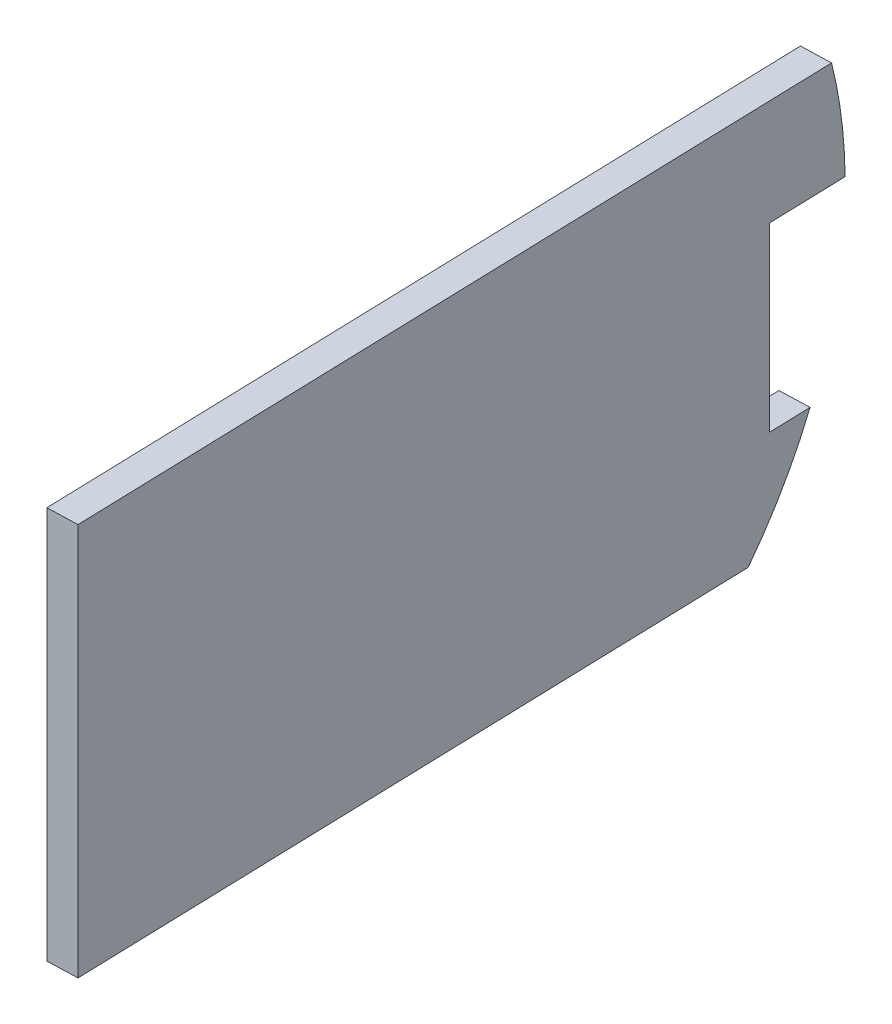
ISO-10303-21;
HEADER;
FILE_DESCRIPTION(('STEP AP214'),'2;1');
FILE_NAME('part.step','',(''),(''),'','','');
FILE_SCHEMA(('AUTOMOTIVE_DESIGN { 1 0 10303 214 1 1 1 1 }'));
ENDSEC;
DATA;
#1=APPLICATION_CONTEXT('core data for automotive mechanical design processes');
#2=APPLICATION_PROTOCOL_DEFINITION('international standard','automotive_design',2000,#1);
#3=PRODUCT_CONTEXT('',#1,'mechanical');
#4=PRODUCT('Part','Part','',(#3));
#5=PRODUCT_RELATED_PRODUCT_CATEGORY('part','',(#4));
#6=PRODUCT_DEFINITION_FORMATION('','',#4);
#7=PRODUCT_DEFINITION_CONTEXT('part definition',#1,'design');
#8=PRODUCT_DEFINITION('design','',#6,#7);
#9=PRODUCT_DEFINITION_SHAPE('','',#8);
#10=(LENGTH_UNIT() NAMED_UNIT(*) SI_UNIT(.MILLI.,.METRE.));
#11=(NAMED_UNIT(*) PLANE_ANGLE_UNIT() SI_UNIT($,.RADIAN.));
#12=(NAMED_UNIT(*) SI_UNIT($,.STERADIAN.) SOLID_ANGLE_UNIT());
#13=UNCERTAINTY_MEASURE_WITH_UNIT(LENGTH_MEASURE(1.E-05),#10,'distance_accuracy_value','');
#14=(GEOMETRIC_REPRESENTATION_CONTEXT(3) GLOBAL_UNCERTAINTY_ASSIGNED_CONTEXT((#13)) GLOBAL_UNIT_ASSIGNED_CONTEXT((#10,
#11,#12)) REPRESENTATION_CONTEXT('',''));
#15=CARTESIAN_POINT('',(0.,0.,0.));
#16=DIRECTION('',(0.,0.,1.));
#17=DIRECTION('',(1.,0.,0.));
#18=AXIS2_PLACEMENT_3D('',#15,#16,#17);
#19=CARTESIAN_POINT('',(-4.18759539835807,34.9489254476313,-56.5128425564197));
#20=DIRECTION('',(0.999559528399924,0.,-0.0296774187712064));
#21=DIRECTION('',(-0.0296774187712064,0.,-0.999559528399924));
#22=AXIS2_PLACEMENT_3D('',#19,#20,#21);
#23=CYLINDRICAL_SURFACE('',#22,74.0000000000029);
#24=CARTESIAN_POINT('',(-4.18759539835807,34.9489254476313,-56.5128425564197));
#25=DIRECTION('',(0.999559528399924,0.,-0.0296774187712064));
#26=DIRECTION('',(0.0296774187712064,0.,0.999559528399924));
#27=AXIS2_PLACEMENT_3D('',#24,#25,#26);
#28=CIRCLE('',#27,74.0000000000029);
#29=CARTESIAN_POINT('',(-5.8924764687525,-11.696898822567,-113.934619424521));
#30=VERTEX_POINT('',#29);
#31=CARTESIAN_POINT('',(-6.2062099073756,5.80310117743449,-124.501416030756));
#32=VERTEX_POINT('',#31);
#33=EDGE_CURVE('E158',#30,#32,#28,.T.);
#34=ORIENTED_EDGE('',*,*,#33,.T.);
#35=DIRECTION('',(0.999559528399924,0.,-0.0296774187712064));
#36=VECTOR('',#35,1.);
#37=CARTESIAN_POINT('',(-6.2062099073756,5.80310117743449,-124.501416030756));
#38=LINE('',#37,#36);
#39=CARTESIAN_POINT('',(-1.20841226537599,5.8031011774345,-124.649803124612));
#40=VERTEX_POINT('',#39);
#41=EDGE_CURVE('E164',#32,#40,#38,.T.);
#42=ORIENTED_EDGE('',*,*,#41,.T.);
#43=CARTESIAN_POINT('',(0.810202243641547,34.9489254476313,-56.6612296502757));
#44=DIRECTION('',(0.999559528399924,0.,-0.0296774187712064));
#45=DIRECTION('',(0.0296774187712064,0.,0.999559528399924));
#46=AXIS2_PLACEMENT_3D('',#43,#44,#45);
#47=CIRCLE('',#46,74.0000000000029);
#48=CARTESIAN_POINT('',(-0.894678826752876,-11.696898822567,-114.083006518377));
#49=VERTEX_POINT('',#48);
#50=EDGE_CURVE('E128',#49,#40,#47,.T.);
#51=ORIENTED_EDGE('',*,*,#50,.F.);
#52=DIRECTION('',(0.999559528399924,0.,-0.0296774187712064));
#53=VECTOR('',#52,1.);
#54=CARTESIAN_POINT('',(-5.8924764687525,-11.696898822567,-113.934619424521));
#55=LINE('',#54,#53);
#56=EDGE_CURVE('E145',#30,#49,#55,.T.);
#57=ORIENTED_EDGE('',*,*,#56,.F.);
#58=EDGE_LOOP('',(#34,#42,#51,#57));
#59=FACE_BOUND('',#58,.T.);
#60=ADVANCED_FACE('F33',(#59),#23,.T.);
#61=CARTESIAN_POINT('',(-4.18759539835807,34.9489254476313,-56.5128425564197));
#62=DIRECTION('',(-0.999559528399924,0.,0.0296774187712064));
#63=DIRECTION('',(0.0296774187712064,0.,0.999559528399924));
#64=AXIS2_PLACEMENT_3D('',#61,#62,#63);
#65=PLANE('',#64);
#66=DIRECTION('',(0.,1.,0.));
#67=VECTOR('',#66,1.);
#68=CARTESIAN_POINT('',(-6.00012013096211,34.9489254476313,-117.560145251513));
#69=LINE('',#68,#67);
#70=CARTESIAN_POINT('',(-6.00012013096211,5.80310117743449,-117.560145251513));
#71=VERTEX_POINT('',#70);
#72=CARTESIAN_POINT('',(-6.00012013096211,35.8031011774345,-117.560145251513));
#73=VERTEX_POINT('',#72);
#74=EDGE_CURVE('E166',#71,#73,#69,.T.);
#75=ORIENTED_EDGE('',*,*,#74,.F.);
#76=DIRECTION('',(-0.0296774187712064,0.,-0.999559528399924));
#77=VECTOR('',#76,1.);
#78=CARTESIAN_POINT('',(-4.18759539835807,5.80310117743447,-56.5128425564197));
#79=LINE('',#78,#77);
#80=EDGE_CURVE('E112',#71,#32,#79,.T.);
#81=ORIENTED_EDGE('',*,*,#80,.T.);
#82=ORIENTED_EDGE('',*,*,#33,.F.);
#83=DIRECTION('',(-0.0296774187712064,0.,-0.999559528399924));
#84=VECTOR('',#83,1.);
#85=CARTESIAN_POINT('',(-2.4977976419995,-11.6968988225669,0.400916064521021));
#86=LINE('',#85,#84);
#87=CARTESIAN_POINT('',(-2.4977976419995,-11.6968988225669,0.400916064521021));
#88=VERTEX_POINT('',#87);
#89=EDGE_CURVE('E170',#88,#30,#86,.T.);
#90=ORIENTED_EDGE('',*,*,#89,.F.);
#91=DIRECTION('',(0.,-1.,0.));
#92=VECTOR('',#91,1.);
#93=CARTESIAN_POINT('',(-2.49779764199951,53.3031011774333,0.400916064521021));
#94=LINE('',#93,#92);
#95=CARTESIAN_POINT('',(-2.49779764199951,53.3031011774333,0.400916064521021));
#96=VERTEX_POINT('',#95);
#97=EDGE_CURVE('E136',#96,#88,#94,.T.);
#98=ORIENTED_EDGE('',*,*,#97,.F.);
#99=DIRECTION('',(0.0296774187712064,0.,0.999559528399924));
#100=VECTOR('',#99,1.);
#101=CARTESIAN_POINT('',(-5.97636299558322,53.3031011774348,-116.759985668278));
#102=LINE('',#101,#100);
#103=CARTESIAN_POINT('',(-6.31510085773342,53.3031011774348,-128.168951533954));
#104=VERTEX_POINT('',#103);
#105=EDGE_CURVE('E57',#104,#96,#102,.T.);
#106=ORIENTED_EDGE('',*,*,#105,.F.);
#107=CARTESIAN_POINT('',(-6.38357807765617,35.8031011774345,-130.475319826284));
#108=VERTEX_POINT('',#107);
#109=EDGE_CURVE('E151',#108,#104,#28,.T.);
#110=ORIENTED_EDGE('',*,*,#109,.F.);
#111=DIRECTION('',(-0.0296774187712064,0.,-0.999559528399924));
#112=VECTOR('',#111,1.);
#113=CARTESIAN_POINT('',(-4.18759539835807,35.8031011774345,-56.5128425564197));
#114=LINE('',#113,#112);
#115=EDGE_CURVE('E115',#73,#108,#114,.T.);
#116=ORIENTED_EDGE('',*,*,#115,.F.);
#117=EDGE_LOOP('',(#75,#81,#82,#90,#98,#106,#110,#116));
#118=FACE_BOUND('',#117,.T.);
#119=ADVANCED_FACE('F155',(#118),#65,.T.);
#120=CARTESIAN_POINT('',(0.810202243641547,34.9489254476313,-56.6612296502757));
#121=DIRECTION('',(-0.999559528399924,0.,0.0296774187712064));
#122=DIRECTION('',(0.0296774187712064,0.,0.999559528399924));
#123=AXIS2_PLACEMENT_3D('',#120,#121,#122);
#124=PLANE('',#123);
#125=DIRECTION('',(-0.0296774187712064,0.,-0.999559528399924));
#126=VECTOR('',#125,1.);
#127=CARTESIAN_POINT('',(0.81020224364155,5.80310117743447,-56.6612296502757));
#128=LINE('',#127,#126);
#129=CARTESIAN_POINT('',(-1.00232248896249,5.80310117743449,-117.708532345369));
#130=VERTEX_POINT('',#129);
#131=EDGE_CURVE('E11',#130,#40,#128,.T.);
#132=ORIENTED_EDGE('',*,*,#131,.F.);
#133=DIRECTION('',(0.,-1.,0.));
#134=VECTOR('',#133,1.);
#135=CARTESIAN_POINT('',(-1.0023224889625,35.8031011774345,-117.708532345369));
#136=LINE('',#135,#134);
#137=CARTESIAN_POINT('',(-1.0023224889625,35.8031011774345,-117.708532345369));
#138=VERTEX_POINT('',#137);
#139=EDGE_CURVE('E119',#138,#130,#136,.T.);
#140=ORIENTED_EDGE('',*,*,#139,.F.);
#141=DIRECTION('',(-0.0296774187712064,0.,-0.999559528399924));
#142=VECTOR('',#141,1.);
#143=CARTESIAN_POINT('',(0.810202243641547,35.8031011774345,-56.6612296502757));
#144=LINE('',#143,#142);
#145=CARTESIAN_POINT('',(-1.38578043565655,35.8031011774345,-130.623706920141));
#146=VERTEX_POINT('',#145);
#147=EDGE_CURVE('E41',#138,#146,#144,.T.);
#148=ORIENTED_EDGE('',*,*,#147,.T.);
#149=CARTESIAN_POINT('',(-1.3173032157338,53.3031011774348,-128.31733862781));
#150=VERTEX_POINT('',#149);
#151=EDGE_CURVE('E133',#146,#150,#47,.T.);
#152=ORIENTED_EDGE('',*,*,#151,.T.);
#153=DIRECTION('',(0.0296774187712064,0.,0.999559528399924));
#154=VECTOR('',#153,1.);
#155=CARTESIAN_POINT('',(2.50000000000011,53.3031011774333,0.252528970664989));
#156=LINE('',#155,#154);
#157=CARTESIAN_POINT('',(2.50000000000011,53.3031011774333,0.252528970664989));
#158=VERTEX_POINT('',#157);
#159=EDGE_CURVE('E132',#150,#158,#156,.T.);
#160=ORIENTED_EDGE('',*,*,#159,.T.);
#161=DIRECTION('',(0.,-1.,0.));
#162=VECTOR('',#161,1.);
#163=CARTESIAN_POINT('',(2.50000000000011,53.3031011774333,0.252528970664989));
#164=LINE('',#163,#162);
#165=CARTESIAN_POINT('',(2.50000000000012,-11.6968988225669,0.252528970664989));
#166=VERTEX_POINT('',#165);
#167=EDGE_CURVE('E163',#158,#166,#164,.T.);
#168=ORIENTED_EDGE('',*,*,#167,.T.);
#169=DIRECTION('',(-0.0296774187712064,0.,-0.999559528399924));
#170=VECTOR('',#169,1.);
#171=CARTESIAN_POINT('',(2.50000000000012,-11.6968988225669,0.252528970664989));
#172=LINE('',#171,#170);
#173=EDGE_CURVE('E130',#166,#49,#172,.T.);
#174=ORIENTED_EDGE('',*,*,#173,.T.);
#175=ORIENTED_EDGE('',*,*,#50,.T.);
#176=EDGE_LOOP('',(#132,#140,#148,#152,#160,#168,#174,#175));
#177=FACE_BOUND('',#176,.T.);
#178=ADVANCED_FACE('F125',(#177),#124,.F.);
#179=CARTESIAN_POINT('',(-2.49779764199951,53.3031011774333,0.400916064521021));
#180=DIRECTION('',(0.0296774187712064,0.,0.999559528399924));
#181=DIRECTION('',(0.999559528399924,0.,-0.0296774187712064));
#182=AXIS2_PLACEMENT_3D('',#179,#180,#181);
#183=PLANE('',#182);
#184=ORIENTED_EDGE('',*,*,#167,.F.);
#185=DIRECTION('',(0.999559528399924,0.,-0.0296774187712064));
#186=VECTOR('',#185,1.);
#187=CARTESIAN_POINT('',(-2.49779764199951,53.3031011774333,0.400916064521021));
#188=LINE('',#187,#186);
#189=EDGE_CURVE('E76',#96,#158,#188,.T.);
#190=ORIENTED_EDGE('',*,*,#189,.F.);
#191=ORIENTED_EDGE('',*,*,#97,.T.);
#192=DIRECTION('',(0.999559528399924,0.,-0.0296774187712064));
#193=VECTOR('',#192,1.);
#194=CARTESIAN_POINT('',(-2.4977976419995,-11.6968988225669,0.400916064521021));
#195=LINE('',#194,#193);
#196=EDGE_CURVE('E83',#88,#166,#195,.T.);
#197=ORIENTED_EDGE('',*,*,#196,.T.);
#198=EDGE_LOOP('',(#184,#190,#191,#197));
#199=FACE_BOUND('',#198,.T.);
#200=ADVANCED_FACE('F35',(#199),#183,.T.);
#201=CARTESIAN_POINT('',(-2.49779764199951,53.3031011774333,0.400916064521021));
#202=DIRECTION('',(0.,1.,0.));
#203=DIRECTION('',(0.,0.,1.));
#204=AXIS2_PLACEMENT_3D('',#201,#202,#203);
#205=PLANE('',#204);
#206=ORIENTED_EDGE('',*,*,#159,.F.);
#207=DIRECTION('',(0.999559528399924,0.,-0.0296774187712064));
#208=VECTOR('',#207,1.);
#209=CARTESIAN_POINT('',(-6.31510085773342,53.3031011774348,-128.168951533954));
#210=LINE('',#209,#208);
#211=EDGE_CURVE('E142',#104,#150,#210,.T.);
#212=ORIENTED_EDGE('',*,*,#211,.F.);
#213=ORIENTED_EDGE('',*,*,#105,.T.);
#214=ORIENTED_EDGE('',*,*,#189,.T.);
#215=EDGE_LOOP('',(#206,#212,#213,#214));
#216=FACE_BOUND('',#215,.T.);
#217=ADVANCED_FACE('F152',(#216),#205,.T.);
#218=DIRECTION('',(0.999559528399924,0.,-0.0296774187712064));
#219=VECTOR('',#218,1.);
#220=CARTESIAN_POINT('',(-6.38357807765617,35.8031011774345,-130.475319826284));
#221=LINE('',#220,#219);
#222=EDGE_CURVE('E48',#108,#146,#221,.T.);
#223=ORIENTED_EDGE('',*,*,#222,.F.);
#224=ORIENTED_EDGE('',*,*,#109,.T.);
#225=ORIENTED_EDGE('',*,*,#211,.T.);
#226=ORIENTED_EDGE('',*,*,#151,.F.);
#227=EDGE_LOOP('',(#223,#224,#225,#226));
#228=FACE_BOUND('',#227,.T.);
#229=ADVANCED_FACE('F149',(#228),#23,.T.);
#230=CARTESIAN_POINT('',(-2.4977976419995,-11.6968988225669,0.400916064521021));
#231=DIRECTION('',(0.,-1.,0.));
#232=DIRECTION('',(1.,0.,0.));
#233=AXIS2_PLACEMENT_3D('',#230,#231,#232);
#234=PLANE('',#233);
#235=ORIENTED_EDGE('',*,*,#173,.F.);
#236=ORIENTED_EDGE('',*,*,#196,.F.);
#237=ORIENTED_EDGE('',*,*,#89,.T.);
#238=ORIENTED_EDGE('',*,*,#56,.T.);
#239=EDGE_LOOP('',(#235,#236,#237,#238));
#240=FACE_BOUND('',#239,.T.);
#241=ADVANCED_FACE('F171',(#240),#234,.T.);
#242=CARTESIAN_POINT('',(-11.4430790545298,5.8031011774345,-132.405151083656));
#243=DIRECTION('',(0.,1.,0.));
#244=DIRECTION('',(0.,0.,1.));
#245=AXIS2_PLACEMENT_3D('',#242,#243,#244);
#246=PLANE('',#245);
#247=ORIENTED_EDGE('',*,*,#80,.F.);
#248=DIRECTION('',(0.999559528399924,0.,-0.0296774187712064));
#249=VECTOR('',#248,1.);
#250=CARTESIAN_POINT('',(-10.9979177729617,5.80310117743449,-117.411758157657));
#251=LINE('',#250,#249);
#252=EDGE_CURVE('E106',#71,#130,#251,.T.);
#253=ORIENTED_EDGE('',*,*,#252,.T.);
#254=ORIENTED_EDGE('',*,*,#131,.T.);
#255=ORIENTED_EDGE('',*,*,#41,.F.);
#256=EDGE_LOOP('',(#247,#253,#254,#255));
#257=FACE_BOUND('',#256,.T.);
#258=ADVANCED_FACE('F108',(#257),#246,.T.);
#259=CARTESIAN_POINT('',(-10.9979177729617,35.8031011774345,-117.411758157657));
#260=DIRECTION('',(0.0296774187712064,0.,0.999559528399924));
#261=DIRECTION('',(0.999559528399924,0.,-0.0296774187712064));
#262=AXIS2_PLACEMENT_3D('',#259,#260,#261);
#263=PLANE('',#262);
#264=ORIENTED_EDGE('',*,*,#74,.T.);
#265=DIRECTION('',(0.999559528399924,0.,-0.0296774187712064));
#266=VECTOR('',#265,1.);
#267=CARTESIAN_POINT('',(-10.9979177729617,35.8031011774345,-117.411758157657));
#268=LINE('',#267,#266);
#269=EDGE_CURVE('E116',#73,#138,#268,.T.);
#270=ORIENTED_EDGE('',*,*,#269,.T.);
#271=ORIENTED_EDGE('',*,*,#139,.T.);
#272=ORIENTED_EDGE('',*,*,#252,.F.);
#273=EDGE_LOOP('',(#264,#270,#271,#272));
#274=FACE_BOUND('',#273,.T.);
#275=ADVANCED_FACE('F120',(#274),#263,.F.);
#276=CARTESIAN_POINT('',(-11.4430790545298,35.8031011774345,-132.405151083656));
#277=DIRECTION('',(0.,1.,0.));
#278=DIRECTION('',(0.,0.,1.));
#279=AXIS2_PLACEMENT_3D('',#276,#277,#278);
#280=PLANE('',#279);
#281=ORIENTED_EDGE('',*,*,#222,.T.);
#282=ORIENTED_EDGE('',*,*,#147,.F.);
#283=ORIENTED_EDGE('',*,*,#269,.F.);
#284=ORIENTED_EDGE('',*,*,#115,.T.);
#285=EDGE_LOOP('',(#281,#282,#283,#284));
#286=FACE_BOUND('',#285,.T.);
#287=ADVANCED_FACE('F198',(#286),#280,.F.);
#288=CLOSED_SHELL('',(#60,#119,#178,#200,#217,#229,#241,#258,#275,#287));
#289=MANIFOLD_SOLID_BREP('B2',#288);
#290=ADVANCED_BREP_SHAPE_REPRESENTATION('',(#18,#289),#14);
#291=SHAPE_DEFINITION_REPRESENTATION(#9,#290);
ENDSEC;
END-ISO-10303-21;
